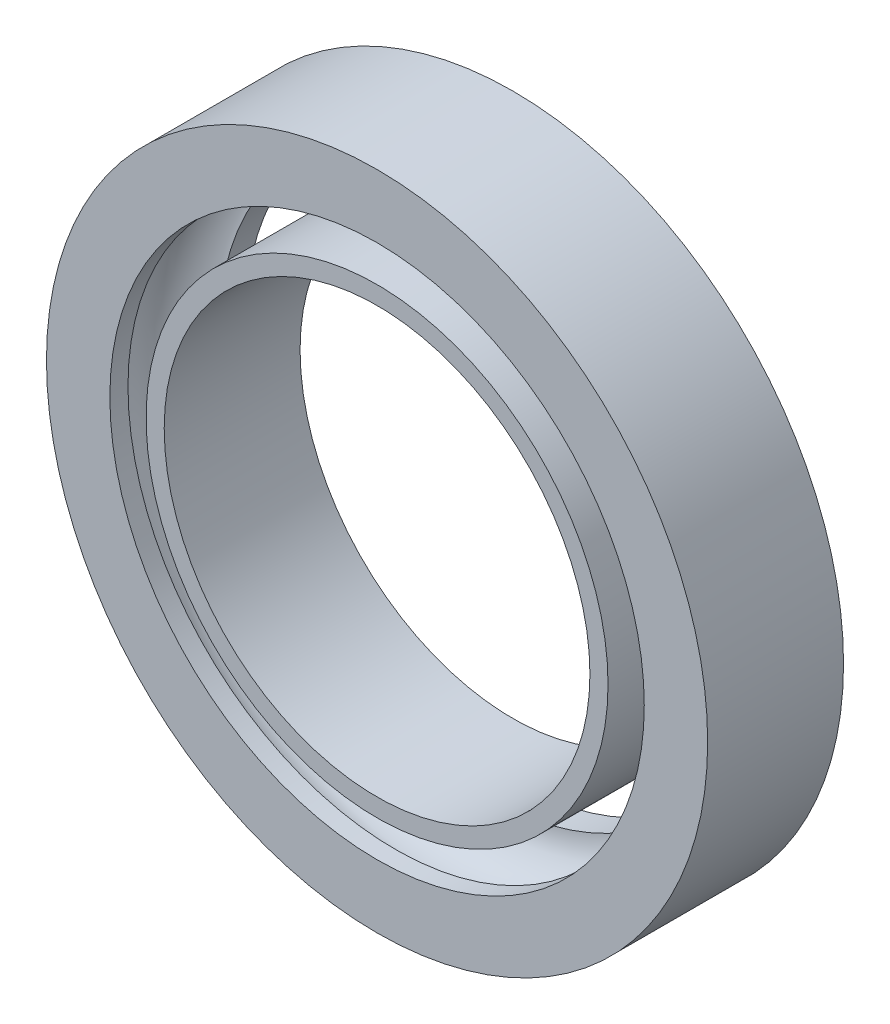
ISO-10303-21;
HEADER;
FILE_DESCRIPTION(('STEP AP214'),'2;1');
FILE_NAME('part.step','',(''),(''),'','','');
FILE_SCHEMA(('AUTOMOTIVE_DESIGN { 1 0 10303 214 1 1 1 1 }'));
ENDSEC;
DATA;
#1=APPLICATION_CONTEXT('core data for automotive mechanical design processes');
#2=APPLICATION_PROTOCOL_DEFINITION('international standard','automotive_design',2000,#1);
#3=PRODUCT_CONTEXT('',#1,'mechanical');
#4=PRODUCT('Part','Part','',(#3));
#5=PRODUCT_RELATED_PRODUCT_CATEGORY('part','',(#4));
#6=PRODUCT_DEFINITION_FORMATION('','',#4);
#7=PRODUCT_DEFINITION_CONTEXT('part definition',#1,'design');
#8=PRODUCT_DEFINITION('design','',#6,#7);
#9=PRODUCT_DEFINITION_SHAPE('','',#8);
#10=(LENGTH_UNIT() NAMED_UNIT(*) SI_UNIT(.MILLI.,.METRE.));
#11=(NAMED_UNIT(*) PLANE_ANGLE_UNIT() SI_UNIT($,.RADIAN.));
#12=(NAMED_UNIT(*) SI_UNIT($,.STERADIAN.) SOLID_ANGLE_UNIT());
#13=UNCERTAINTY_MEASURE_WITH_UNIT(LENGTH_MEASURE(1.E-05),#10,'distance_accuracy_value','');
#14=(GEOMETRIC_REPRESENTATION_CONTEXT(3) GLOBAL_UNCERTAINTY_ASSIGNED_CONTEXT((#13)) GLOBAL_UNIT_ASSIGNED_CONTEXT((#10,
#11,#12)) REPRESENTATION_CONTEXT('',''));
#15=CARTESIAN_POINT('',(0.,0.,0.));
#16=DIRECTION('',(0.,0.,1.));
#17=DIRECTION('',(1.,0.,0.));
#18=AXIS2_PLACEMENT_3D('',#15,#16,#17);
#19=CARTESIAN_POINT('',(0.,0.,15.));
#20=DIRECTION('',(0.,0.,-1.));
#21=DIRECTION('',(-1.,0.,0.));
#22=AXIS2_PLACEMENT_3D('',#19,#20,#21);
#23=CYLINDRICAL_SURFACE('',#22,29.5);
#24=CARTESIAN_POINT('',(0.,0.,3.));
#25=DIRECTION('',(0.,0.,-1.));
#26=DIRECTION('',(-1.,0.,0.));
#27=AXIS2_PLACEMENT_3D('',#24,#25,#26);
#28=CIRCLE('',#27,29.5);
#29=CARTESIAN_POINT('',(-29.5,0.,3.));
#30=VERTEX_POINT('',#29);
#31=EDGE_CURVE('E61',#30,#30,#28,.T.);
#32=ORIENTED_EDGE('',*,*,#31,.F.);
#33=EDGE_LOOP('',(#32));
#34=FACE_BOUND('',#33,.T.);
#35=CARTESIAN_POINT('',(0.,0.,0.));
#36=DIRECTION('',(0.,0.,1.));
#37=DIRECTION('',(1.,0.,0.));
#38=AXIS2_PLACEMENT_3D('',#35,#36,#37);
#39=CIRCLE('',#38,29.5);
#40=CARTESIAN_POINT('',(29.5,0.,0.));
#41=VERTEX_POINT('',#40);
#42=EDGE_CURVE('E53',#41,#41,#39,.T.);
#43=ORIENTED_EDGE('',*,*,#42,.F.);
#44=EDGE_LOOP('',(#43));
#45=FACE_BOUND('',#44,.T.);
#46=ADVANCED_FACE('F40',(#34,#45),#23,.F.);
#47=CARTESIAN_POINT('',(0.,0.,15.));
#48=DIRECTION('',(0.,0.,1.));
#49=DIRECTION('',(1.,0.,0.));
#50=AXIS2_PLACEMENT_3D('',#47,#48,#49);
#51=PLANE('',#50);
#52=CARTESIAN_POINT('',(0.,0.,15.));
#53=DIRECTION('',(0.,0.,1.));
#54=DIRECTION('',(1.,0.,0.));
#55=AXIS2_PLACEMENT_3D('',#52,#53,#54);
#56=CIRCLE('',#55,36.5);
#57=CARTESIAN_POINT('',(36.5,0.,15.));
#58=VERTEX_POINT('',#57);
#59=EDGE_CURVE('E11',#58,#58,#56,.T.);
#60=ORIENTED_EDGE('',*,*,#59,.T.);
#61=EDGE_LOOP('',(#60));
#62=FACE_BOUND('',#61,.T.);
#63=CARTESIAN_POINT('',(0.,0.,15.));
#64=DIRECTION('',(0.,0.,1.));
#65=DIRECTION('',(1.,0.,0.));
#66=AXIS2_PLACEMENT_3D('',#63,#64,#65);
#67=CIRCLE('',#66,29.5);
#68=CARTESIAN_POINT('',(29.5,0.,15.));
#69=VERTEX_POINT('',#68);
#70=EDGE_CURVE('E51',#69,#69,#67,.T.);
#71=ORIENTED_EDGE('',*,*,#70,.F.);
#72=EDGE_LOOP('',(#71));
#73=FACE_BOUND('',#72,.T.);
#74=ADVANCED_FACE('F69',(#62,#73),#51,.T.);
#75=CARTESIAN_POINT('',(0.,0.,0.));
#76=DIRECTION('',(0.,0.,1.));
#77=DIRECTION('',(1.,0.,0.));
#78=AXIS2_PLACEMENT_3D('',#75,#76,#77);
#79=PLANE('',#78);
#80=CARTESIAN_POINT('',(0.,0.,0.));
#81=DIRECTION('',(0.,0.,1.));
#82=DIRECTION('',(1.,0.,0.));
#83=AXIS2_PLACEMENT_3D('',#80,#81,#82);
#84=CIRCLE('',#83,36.5);
#85=CARTESIAN_POINT('',(36.5,0.,0.));
#86=VERTEX_POINT('',#85);
#87=EDGE_CURVE('E44',#86,#86,#84,.T.);
#88=ORIENTED_EDGE('',*,*,#87,.F.);
#89=EDGE_LOOP('',(#88));
#90=FACE_BOUND('',#89,.T.);
#91=ORIENTED_EDGE('',*,*,#42,.T.);
#92=EDGE_LOOP('',(#91));
#93=FACE_BOUND('',#92,.T.);
#94=ADVANCED_FACE('F74',(#90,#93),#79,.F.);
#95=CARTESIAN_POINT('',(0.,0.,15.));
#96=DIRECTION('',(0.,0.,-1.));
#97=DIRECTION('',(-1.,0.,0.));
#98=AXIS2_PLACEMENT_3D('',#95,#96,#97);
#99=CYLINDRICAL_SURFACE('',#98,36.5);
#100=ORIENTED_EDGE('',*,*,#59,.F.);
#101=EDGE_LOOP('',(#100));
#102=FACE_BOUND('',#101,.T.);
#103=ORIENTED_EDGE('',*,*,#87,.T.);
#104=EDGE_LOOP('',(#103));
#105=FACE_BOUND('',#104,.T.);
#106=ADVANCED_FACE('F42',(#102,#105),#99,.T.);
#107=CARTESIAN_POINT('',(0.,0.,13.));
#108=DIRECTION('',(0.,0.,-1.));
#109=DIRECTION('',(-1.,0.,0.));
#110=AXIS2_PLACEMENT_3D('',#107,#108,#109);
#111=CIRCLE('',#110,29.5);
#112=CARTESIAN_POINT('',(-29.5,0.,13.));
#113=VERTEX_POINT('',#112);
#114=EDGE_CURVE('E56',#113,#113,#111,.T.);
#115=ORIENTED_EDGE('',*,*,#114,.T.);
#116=EDGE_LOOP('',(#115));
#117=FACE_BOUND('',#116,.T.);
#118=ORIENTED_EDGE('',*,*,#70,.T.);
#119=EDGE_LOOP('',(#118));
#120=FACE_BOUND('',#119,.T.);
#121=ADVANCED_FACE('F71',(#117,#120),#23,.F.);
#122=CARTESIAN_POINT('',(0.,0.,8.));
#123=DIRECTION('',(0.,0.,-1.));
#124=DIRECTION('',(-1.,0.,0.));
#125=AXIS2_PLACEMENT_3D('',#122,#123,#124);
#126=TOROIDAL_SURFACE('',#125,29.5,5.);
#127=ORIENTED_EDGE('',*,*,#114,.F.);
#128=EDGE_LOOP('',(#127));
#129=FACE_BOUND('',#128,.T.);
#130=ORIENTED_EDGE('',*,*,#31,.T.);
#131=EDGE_LOOP('',(#130));
#132=FACE_BOUND('',#131,.T.);
#133=ADVANCED_FACE('F65',(#129,#132),#126,.F.);
#134=CLOSED_SHELL('',(#46,#74,#94,#106,#121,#133));
#135=MANIFOLD_SOLID_BREP('B2',#134);
#136=CARTESIAN_POINT('',(0.,0.,15.));
#137=DIRECTION('',(0.,0.,1.));
#138=DIRECTION('',(1.,0.,0.));
#139=AXIS2_PLACEMENT_3D('',#136,#137,#138);
#140=PLANE('',#139);
#141=CARTESIAN_POINT('',(0.,0.,15.));
#142=DIRECTION('',(0.,0.,1.));
#143=DIRECTION('',(1.,0.,0.));
#144=AXIS2_PLACEMENT_3D('',#141,#142,#143);
#145=CIRCLE('',#144,25.5);
#146=CARTESIAN_POINT('',(25.5,0.,15.));
#147=VERTEX_POINT('',#146);
#148=EDGE_CURVE('E39',#147,#147,#145,.T.);
#149=ORIENTED_EDGE('',*,*,#148,.T.);
#150=EDGE_LOOP('',(#149));
#151=FACE_BOUND('',#150,.T.);
#152=CARTESIAN_POINT('',(0.,0.,15.));
#153=DIRECTION('',(0.,0.,1.));
#154=DIRECTION('',(1.,0.,0.));
#155=AXIS2_PLACEMENT_3D('',#152,#153,#154);
#156=CIRCLE('',#155,23.5);
#157=CARTESIAN_POINT('',(23.5,0.,15.));
#158=VERTEX_POINT('',#157);
#159=EDGE_CURVE('E141',#158,#158,#156,.T.);
#160=ORIENTED_EDGE('',*,*,#159,.F.);
#161=EDGE_LOOP('',(#160));
#162=FACE_BOUND('',#161,.T.);
#163=ADVANCED_FACE('F130',(#151,#162),#140,.T.);
#164=CARTESIAN_POINT('',(0.,0.,0.));
#165=DIRECTION('',(0.,0.,1.));
#166=DIRECTION('',(1.,0.,0.));
#167=AXIS2_PLACEMENT_3D('',#164,#165,#166);
#168=PLANE('',#167);
#169=CARTESIAN_POINT('',(0.,0.,0.));
#170=DIRECTION('',(0.,0.,1.));
#171=DIRECTION('',(1.,0.,0.));
#172=AXIS2_PLACEMENT_3D('',#169,#170,#171);
#173=CIRCLE('',#172,25.5);
#174=CARTESIAN_POINT('',(25.5,0.,0.));
#175=VERTEX_POINT('',#174);
#176=EDGE_CURVE('E134',#175,#175,#173,.T.);
#177=ORIENTED_EDGE('',*,*,#176,.F.);
#178=EDGE_LOOP('',(#177));
#179=FACE_BOUND('',#178,.T.);
#180=CARTESIAN_POINT('',(0.,0.,0.));
#181=DIRECTION('',(0.,0.,1.));
#182=DIRECTION('',(1.,0.,0.));
#183=AXIS2_PLACEMENT_3D('',#180,#181,#182);
#184=CIRCLE('',#183,23.5);
#185=CARTESIAN_POINT('',(23.5,0.,0.));
#186=VERTEX_POINT('',#185);
#187=EDGE_CURVE('E143',#186,#186,#184,.T.);
#188=ORIENTED_EDGE('',*,*,#187,.T.);
#189=EDGE_LOOP('',(#188));
#190=FACE_BOUND('',#189,.T.);
#191=ADVANCED_FACE('F153',(#179,#190),#168,.F.);
#192=CARTESIAN_POINT('',(0.,0.,15.));
#193=DIRECTION('',(0.,0.,-1.));
#194=DIRECTION('',(-1.,0.,0.));
#195=AXIS2_PLACEMENT_3D('',#192,#193,#194);
#196=CYLINDRICAL_SURFACE('',#195,25.5);
#197=ORIENTED_EDGE('',*,*,#148,.F.);
#198=EDGE_LOOP('',(#197));
#199=FACE_BOUND('',#198,.T.);
#200=ORIENTED_EDGE('',*,*,#176,.T.);
#201=EDGE_LOOP('',(#200));
#202=FACE_BOUND('',#201,.T.);
#203=ADVANCED_FACE('F132',(#199,#202),#196,.T.);
#204=CARTESIAN_POINT('',(0.,0.,15.));
#205=DIRECTION('',(0.,0.,-1.));
#206=DIRECTION('',(-1.,0.,0.));
#207=AXIS2_PLACEMENT_3D('',#204,#205,#206);
#208=CYLINDRICAL_SURFACE('',#207,23.5);
#209=ORIENTED_EDGE('',*,*,#159,.T.);
#210=EDGE_LOOP('',(#209));
#211=FACE_BOUND('',#210,.T.);
#212=ORIENTED_EDGE('',*,*,#187,.F.);
#213=EDGE_LOOP('',(#212));
#214=FACE_BOUND('',#213,.T.);
#215=ADVANCED_FACE('F149',(#211,#214),#208,.F.);
#216=CLOSED_SHELL('',(#163,#191,#203,#215));
#217=MANIFOLD_SOLID_BREP('B6',#216);
#218=ADVANCED_BREP_SHAPE_REPRESENTATION('',(#18,#135,#217),#14);
#219=SHAPE_DEFINITION_REPRESENTATION(#9,#218);
ENDSEC;
END-ISO-10303-21;
